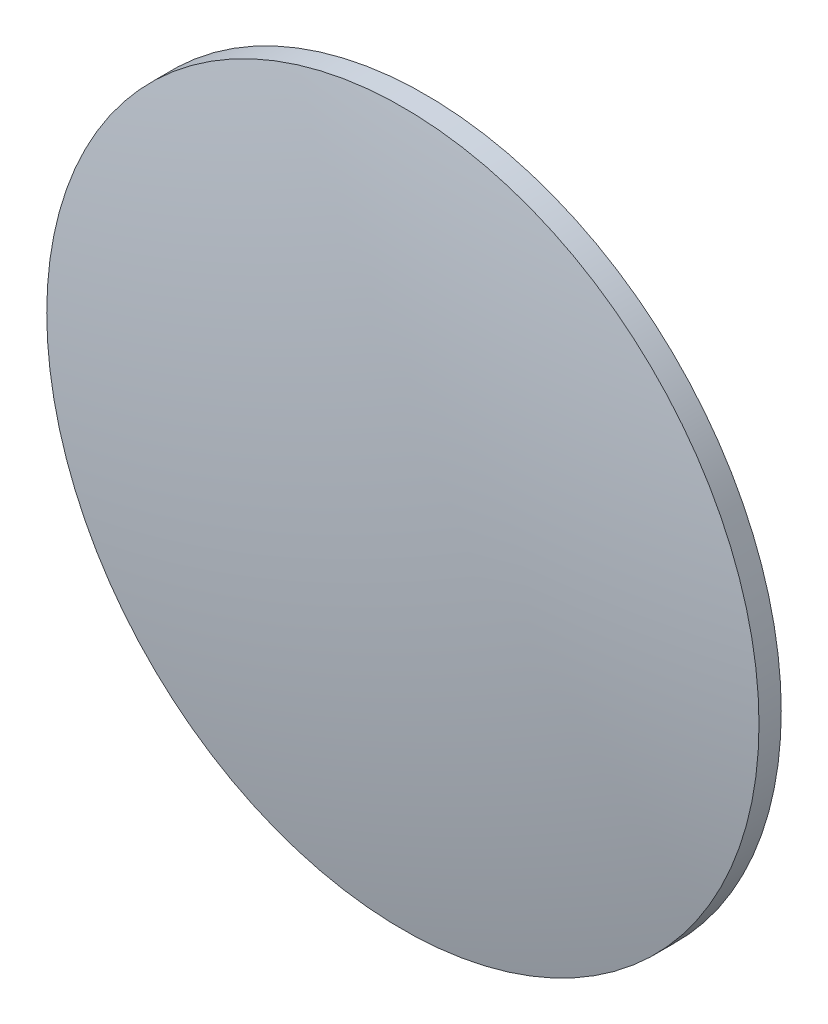
ISO-10303-21;
HEADER;
FILE_DESCRIPTION(('STEP AP214'),'2;1');
FILE_NAME('part.step','',(''),(''),'','','');
FILE_SCHEMA(('AUTOMOTIVE_DESIGN { 1 0 10303 214 1 1 1 1 }'));
ENDSEC;
DATA;
#1=APPLICATION_CONTEXT('core data for automotive mechanical design processes');
#2=APPLICATION_PROTOCOL_DEFINITION('international standard','automotive_design',2000,#1);
#3=PRODUCT_CONTEXT('',#1,'mechanical');
#4=PRODUCT('Part','Part','',(#3));
#5=PRODUCT_RELATED_PRODUCT_CATEGORY('part','',(#4));
#6=PRODUCT_DEFINITION_FORMATION('','',#4);
#7=PRODUCT_DEFINITION_CONTEXT('part definition',#1,'design');
#8=PRODUCT_DEFINITION('design','',#6,#7);
#9=PRODUCT_DEFINITION_SHAPE('','',#8);
#10=(LENGTH_UNIT() NAMED_UNIT(*) SI_UNIT(.MILLI.,.METRE.));
#11=(NAMED_UNIT(*) PLANE_ANGLE_UNIT() SI_UNIT($,.RADIAN.));
#12=(NAMED_UNIT(*) SI_UNIT($,.STERADIAN.) SOLID_ANGLE_UNIT());
#13=UNCERTAINTY_MEASURE_WITH_UNIT(LENGTH_MEASURE(1.E-05),#10,'distance_accuracy_value','');
#14=(GEOMETRIC_REPRESENTATION_CONTEXT(3) GLOBAL_UNCERTAINTY_ASSIGNED_CONTEXT((#13)) GLOBAL_UNIT_ASSIGNED_CONTEXT((#10,
#11,#12)) REPRESENTATION_CONTEXT('',''));
#15=CARTESIAN_POINT('',(0.,0.,0.));
#16=DIRECTION('',(0.,0.,1.));
#17=DIRECTION('',(1.,0.,0.));
#18=AXIS2_PLACEMENT_3D('',#15,#16,#17);
#19=CARTESIAN_POINT('',(0.,0.,-266.964583333332));
#20=DIRECTION('',(0.,0.,1.));
#21=DIRECTION('',(-1.,0.,0.));
#22=AXIS2_PLACEMENT_3D('',#19,#20,#21);
#23=SPHERICAL_SURFACE('',#22,273.314583333333);
#24=CARTESIAN_POINT('',(0.,0.,1.5875));
#25=DIRECTION('',(0.,0.,1.));
#26=DIRECTION('',(1.,0.,0.));
#27=AXIS2_PLACEMENT_3D('',#24,#25,#26);
#28=CIRCLE('',#27,50.8);
#29=CARTESIAN_POINT('',(50.8,0.,1.5875));
#30=VERTEX_POINT('',#29);
#31=EDGE_CURVE('E10',#30,#30,#28,.T.);
#32=ORIENTED_EDGE('',*,*,#31,.T.);
#33=EDGE_LOOP('',(#32));
#34=FACE_BOUND('',#33,.T.);
#35=ADVANCED_FACE('F34',(#34),#23,.T.);
#36=CARTESIAN_POINT('',(0.,0.,6.35));
#37=DIRECTION('',(0.,0.,1.));
#38=DIRECTION('',(1.,0.,0.));
#39=AXIS2_PLACEMENT_3D('',#36,#37,#38);
#40=CYLINDRICAL_SURFACE('',#39,50.8);
#41=CARTESIAN_POINT('',(0.,0.,-1.5875));
#42=DIRECTION('',(0.,0.,1.));
#43=DIRECTION('',(1.,0.,0.));
#44=AXIS2_PLACEMENT_3D('',#41,#42,#43);
#45=CIRCLE('',#44,50.8);
#46=CARTESIAN_POINT('',(50.8,0.,-1.5875));
#47=VERTEX_POINT('',#46);
#48=EDGE_CURVE('E40',#47,#47,#45,.T.);
#49=ORIENTED_EDGE('',*,*,#48,.T.);
#50=EDGE_LOOP('',(#49));
#51=FACE_BOUND('',#50,.T.);
#52=ORIENTED_EDGE('',*,*,#31,.F.);
#53=EDGE_LOOP('',(#52));
#54=FACE_BOUND('',#53,.T.);
#55=ADVANCED_FACE('F46',(#51,#54),#40,.T.);
#56=CARTESIAN_POINT('',(0.,0.,266.964583333332));
#57=DIRECTION('',(0.,0.,1.));
#58=DIRECTION('',(-1.,0.,0.));
#59=AXIS2_PLACEMENT_3D('',#56,#57,#58);
#60=SPHERICAL_SURFACE('',#59,273.314583333333);
#61=ORIENTED_EDGE('',*,*,#48,.F.);
#62=EDGE_LOOP('',(#61));
#63=FACE_BOUND('',#62,.T.);
#64=ADVANCED_FACE('F49',(#63),#60,.T.);
#65=CLOSED_SHELL('',(#35,#55,#64));
#66=MANIFOLD_SOLID_BREP('B2',#65);
#67=ADVANCED_BREP_SHAPE_REPRESENTATION('',(#18,#66),#14);
#68=SHAPE_DEFINITION_REPRESENTATION(#9,#67);
ENDSEC;
END-ISO-10303-21;
